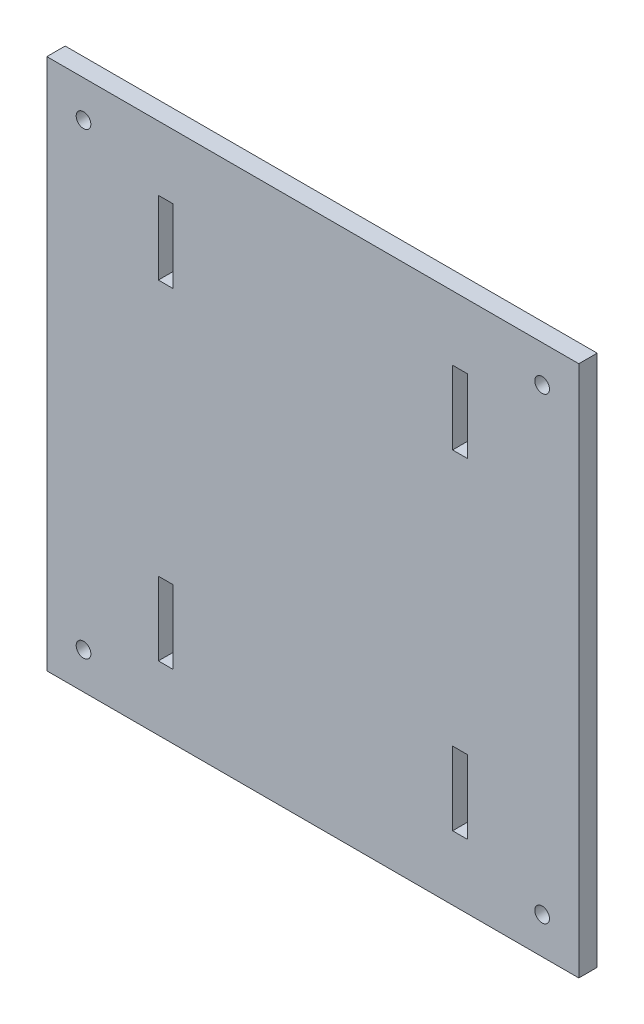
ISO-10303-21;
HEADER;
FILE_DESCRIPTION(('STEP AP214'),'2;1');
FILE_NAME('part.step','',(''),(''),'','','');
FILE_SCHEMA(('AUTOMOTIVE_DESIGN { 1 0 10303 214 1 1 1 1 }'));
ENDSEC;
DATA;
#1=APPLICATION_CONTEXT('core data for automotive mechanical design processes');
#2=APPLICATION_PROTOCOL_DEFINITION('international standard','automotive_design',2000,#1);
#3=PRODUCT_CONTEXT('',#1,'mechanical');
#4=PRODUCT('Part','Part','',(#3));
#5=PRODUCT_RELATED_PRODUCT_CATEGORY('part','',(#4));
#6=PRODUCT_DEFINITION_FORMATION('','',#4);
#7=PRODUCT_DEFINITION_CONTEXT('part definition',#1,'design');
#8=PRODUCT_DEFINITION('design','',#6,#7);
#9=PRODUCT_DEFINITION_SHAPE('','',#8);
#10=(LENGTH_UNIT() NAMED_UNIT(*) SI_UNIT(.MILLI.,.METRE.));
#11=(NAMED_UNIT(*) PLANE_ANGLE_UNIT() SI_UNIT($,.RADIAN.));
#12=(NAMED_UNIT(*) SI_UNIT($,.STERADIAN.) SOLID_ANGLE_UNIT());
#13=UNCERTAINTY_MEASURE_WITH_UNIT(LENGTH_MEASURE(1.E-05),#10,'distance_accuracy_value','');
#14=(GEOMETRIC_REPRESENTATION_CONTEXT(3) GLOBAL_UNCERTAINTY_ASSIGNED_CONTEXT((#13)) GLOBAL_UNIT_ASSIGNED_CONTEXT((#10,
#11,#12)) REPRESENTATION_CONTEXT('',''));
#15=CARTESIAN_POINT('',(0.,0.,0.));
#16=DIRECTION('',(0.,0.,1.));
#17=DIRECTION('',(1.,0.,0.));
#18=AXIS2_PLACEMENT_3D('',#15,#16,#17);
#19=CARTESIAN_POINT('',(-32.9954010493693,86.4917615272113,5.));
#20=DIRECTION('',(1.,0.,0.));
#21=DIRECTION('',(0.,1.,0.));
#22=AXIS2_PLACEMENT_3D('',#19,#20,#21);
#23=PLANE('',#22);
#24=DIRECTION('',(0.,-1.,0.));
#25=VECTOR('',#24,1.);
#26=CARTESIAN_POINT('',(-32.9954010493693,86.4917615272113,0.));
#27=LINE('',#26,#25);
#28=CARTESIAN_POINT('',(-32.9954010493693,86.4917615272113,0.));
#29=VERTEX_POINT('',#28);
#30=CARTESIAN_POINT('',(-32.9954010493693,-58.5082384727887,0.));
#31=VERTEX_POINT('',#30);
#32=EDGE_CURVE('E299',#29,#31,#27,.T.);
#33=ORIENTED_EDGE('',*,*,#32,.T.);
#34=DIRECTION('',(0.,0.,-1.));
#35=VECTOR('',#34,1.);
#36=CARTESIAN_POINT('',(-32.9954010493693,-58.5082384727887,5.));
#37=LINE('',#36,#35);
#38=CARTESIAN_POINT('',(-32.9954010493693,-58.5082384727887,5.));
#39=VERTEX_POINT('',#38);
#40=EDGE_CURVE('E11',#39,#31,#37,.T.);
#41=ORIENTED_EDGE('',*,*,#40,.F.);
#42=DIRECTION('',(0.,-1.,0.));
#43=VECTOR('',#42,1.);
#44=CARTESIAN_POINT('',(-32.9954010493693,86.4917615272113,5.));
#45=LINE('',#44,#43);
#46=CARTESIAN_POINT('',(-32.9954010493693,86.4917615272113,5.));
#47=VERTEX_POINT('',#46);
#48=EDGE_CURVE('E306',#47,#39,#45,.T.);
#49=ORIENTED_EDGE('',*,*,#48,.F.);
#50=DIRECTION('',(0.,0.,-1.));
#51=VECTOR('',#50,1.);
#52=CARTESIAN_POINT('',(-32.9954010493693,86.4917615272113,5.));
#53=LINE('',#52,#51);
#54=EDGE_CURVE('E316',#47,#29,#53,.T.);
#55=ORIENTED_EDGE('',*,*,#54,.T.);
#56=EDGE_LOOP('',(#33,#41,#49,#55));
#57=FACE_BOUND('',#56,.T.);
#58=ADVANCED_FACE('F33',(#57),#23,.F.);
#59=CARTESIAN_POINT('',(-32.9954010493693,-58.5082384727887,5.));
#60=DIRECTION('',(0.,1.,0.));
#61=DIRECTION('',(0.,0.,1.));
#62=AXIS2_PLACEMENT_3D('',#59,#60,#61);
#63=PLANE('',#62);
#64=DIRECTION('',(1.,0.,0.));
#65=VECTOR('',#64,1.);
#66=CARTESIAN_POINT('',(-32.9954010493693,-58.5082384727887,0.));
#67=LINE('',#66,#65);
#68=CARTESIAN_POINT('',(112.004598950631,-58.5082384727887,0.));
#69=VERTEX_POINT('',#68);
#70=EDGE_CURVE('E319',#31,#69,#67,.T.);
#71=ORIENTED_EDGE('',*,*,#70,.T.);
#72=DIRECTION('',(0.,0.,-1.));
#73=VECTOR('',#72,1.);
#74=CARTESIAN_POINT('',(112.004598950631,-58.5082384727887,5.));
#75=LINE('',#74,#73);
#76=CARTESIAN_POINT('',(112.004598950631,-58.5082384727887,5.));
#77=VERTEX_POINT('',#76);
#78=EDGE_CURVE('E40',#77,#69,#75,.T.);
#79=ORIENTED_EDGE('',*,*,#78,.F.);
#80=DIRECTION('',(1.,0.,0.));
#81=VECTOR('',#80,1.);
#82=CARTESIAN_POINT('',(-32.9954010493693,-58.5082384727887,5.));
#83=LINE('',#82,#81);
#84=EDGE_CURVE('E309',#39,#77,#83,.T.);
#85=ORIENTED_EDGE('',*,*,#84,.F.);
#86=ORIENTED_EDGE('',*,*,#40,.T.);
#87=EDGE_LOOP('',(#71,#79,#85,#86));
#88=FACE_BOUND('',#87,.T.);
#89=ADVANCED_FACE('F348',(#88),#63,.F.);
#90=CARTESIAN_POINT('',(112.004598950631,86.4917615272113,5.));
#91=DIRECTION('',(-1.,0.,0.));
#92=DIRECTION('',(0.,-1.,0.));
#93=AXIS2_PLACEMENT_3D('',#90,#91,#92);
#94=PLANE('',#93);
#95=DIRECTION('',(0.,1.,0.));
#96=VECTOR('',#95,1.);
#97=CARTESIAN_POINT('',(112.004598950631,86.4917615272113,0.));
#98=LINE('',#97,#96);
#99=CARTESIAN_POINT('',(112.004598950631,86.4917615272113,0.));
#100=VERTEX_POINT('',#99);
#101=EDGE_CURVE('E321',#69,#100,#98,.T.);
#102=ORIENTED_EDGE('',*,*,#101,.T.);
#103=DIRECTION('',(0.,0.,-1.));
#104=VECTOR('',#103,1.);
#105=CARTESIAN_POINT('',(112.004598950631,86.4917615272113,5.));
#106=LINE('',#105,#104);
#107=CARTESIAN_POINT('',(112.004598950631,86.4917615272113,5.));
#108=VERTEX_POINT('',#107);
#109=EDGE_CURVE('E326',#108,#100,#106,.T.);
#110=ORIENTED_EDGE('',*,*,#109,.F.);
#111=DIRECTION('',(0.,1.,0.));
#112=VECTOR('',#111,1.);
#113=CARTESIAN_POINT('',(112.004598950631,86.4917615272113,5.));
#114=LINE('',#113,#112);
#115=EDGE_CURVE('E312',#77,#108,#114,.T.);
#116=ORIENTED_EDGE('',*,*,#115,.F.);
#117=ORIENTED_EDGE('',*,*,#78,.T.);
#118=EDGE_LOOP('',(#102,#110,#116,#117));
#119=FACE_BOUND('',#118,.T.);
#120=ADVANCED_FACE('F333',(#119),#94,.F.);
#121=CARTESIAN_POINT('',(-32.9954010493693,86.4917615272113,5.));
#122=DIRECTION('',(0.,-1.,0.));
#123=DIRECTION('',(0.,0.,-1.));
#124=AXIS2_PLACEMENT_3D('',#121,#122,#123);
#125=PLANE('',#124);
#126=DIRECTION('',(-1.,0.,0.));
#127=VECTOR('',#126,1.);
#128=CARTESIAN_POINT('',(-32.9954010493693,86.4917615272113,0.));
#129=LINE('',#128,#127);
#130=EDGE_CURVE('E310',#100,#29,#129,.T.);
#131=ORIENTED_EDGE('',*,*,#130,.T.);
#132=ORIENTED_EDGE('',*,*,#54,.F.);
#133=DIRECTION('',(-1.,0.,0.));
#134=VECTOR('',#133,1.);
#135=CARTESIAN_POINT('',(-32.9954010493693,86.4917615272113,5.));
#136=LINE('',#135,#134);
#137=EDGE_CURVE('E314',#108,#47,#136,.T.);
#138=ORIENTED_EDGE('',*,*,#137,.F.);
#139=ORIENTED_EDGE('',*,*,#109,.T.);
#140=EDGE_LOOP('',(#131,#132,#138,#139));
#141=FACE_BOUND('',#140,.T.);
#142=ADVANCED_FACE('F341',(#141),#125,.F.);
#143=CARTESIAN_POINT('',(0.,0.,5.));
#144=DIRECTION('',(0.,0.,1.));
#145=DIRECTION('',(1.,0.,0.));
#146=AXIS2_PLACEMENT_3D('',#143,#144,#145);
#147=PLANE('',#146);
#148=CARTESIAN_POINT('',(-22.9954010493693,-48.5082384727887,5.));
#149=DIRECTION('',(0.,0.,1.));
#150=DIRECTION('',(1.,0.,0.));
#151=AXIS2_PLACEMENT_3D('',#148,#149,#150);
#152=CIRCLE('',#151,2.);
#153=CARTESIAN_POINT('',(-20.9954010493693,-48.5082384727887,5.));
#154=VERTEX_POINT('',#153);
#155=EDGE_CURVE('E446',#154,#154,#152,.T.);
#156=ORIENTED_EDGE('',*,*,#155,.F.);
#157=EDGE_LOOP('',(#156));
#158=FACE_BOUND('',#157,.T.);
#159=CARTESIAN_POINT('',(102.004598950631,-48.5082384727887,5.));
#160=DIRECTION('',(0.,0.,1.));
#161=DIRECTION('',(1.,0.,0.));
#162=AXIS2_PLACEMENT_3D('',#159,#160,#161);
#163=CIRCLE('',#162,2.);
#164=CARTESIAN_POINT('',(104.004598950631,-48.5082384727887,5.));
#165=VERTEX_POINT('',#164);
#166=EDGE_CURVE('E448',#165,#165,#163,.T.);
#167=ORIENTED_EDGE('',*,*,#166,.F.);
#168=EDGE_LOOP('',(#167));
#169=FACE_BOUND('',#168,.T.);
#170=CARTESIAN_POINT('',(102.004598950631,76.4917615272112,5.));
#171=DIRECTION('',(0.,0.,1.));
#172=DIRECTION('',(1.,0.,0.));
#173=AXIS2_PLACEMENT_3D('',#170,#171,#172);
#174=CIRCLE('',#173,2.);
#175=CARTESIAN_POINT('',(104.004598950631,76.4917615272112,5.));
#176=VERTEX_POINT('',#175);
#177=EDGE_CURVE('E454',#176,#176,#174,.T.);
#178=ORIENTED_EDGE('',*,*,#177,.F.);
#179=EDGE_LOOP('',(#178));
#180=FACE_BOUND('',#179,.T.);
#181=CARTESIAN_POINT('',(-22.9954010493693,76.4917615272113,5.));
#182=DIRECTION('',(0.,0.,1.));
#183=DIRECTION('',(1.,0.,0.));
#184=AXIS2_PLACEMENT_3D('',#181,#182,#183);
#185=CIRCLE('',#184,2.);
#186=CARTESIAN_POINT('',(-20.9954010493693,76.4917615272113,5.));
#187=VERTEX_POINT('',#186);
#188=EDGE_CURVE('E193',#187,#187,#185,.T.);
#189=ORIENTED_EDGE('',*,*,#188,.F.);
#190=EDGE_LOOP('',(#189));
#191=FACE_BOUND('',#190,.T.);
#192=DIRECTION('',(0.,-1.,0.));
#193=VECTOR('',#192,1.);
#194=CARTESIAN_POINT('',(77.6045989506307,-20.9582384727888,5.));
#195=LINE('',#194,#193);
#196=CARTESIAN_POINT('',(77.6045989506307,-20.9582384727888,5.));
#197=VERTEX_POINT('',#196);
#198=CARTESIAN_POINT('',(77.6045989506307,-40.9582384727888,5.));
#199=VERTEX_POINT('',#198);
#200=EDGE_CURVE('E47',#197,#199,#195,.T.);
#201=ORIENTED_EDGE('',*,*,#200,.F.);
#202=DIRECTION('',(-1.,0.,0.));
#203=VECTOR('',#202,1.);
#204=CARTESIAN_POINT('',(77.6045989506307,-20.9582384727888,5.));
#205=LINE('',#204,#203);
#206=CARTESIAN_POINT('',(81.6045989506307,-20.9582384727888,5.));
#207=VERTEX_POINT('',#206);
#208=EDGE_CURVE('E187',#207,#197,#205,.T.);
#209=ORIENTED_EDGE('',*,*,#208,.F.);
#210=DIRECTION('',(0.,1.,0.));
#211=VECTOR('',#210,1.);
#212=CARTESIAN_POINT('',(81.6045989506307,-20.9582384727888,5.));
#213=LINE('',#212,#211);
#214=CARTESIAN_POINT('',(81.6045989506307,-40.9582384727888,5.));
#215=VERTEX_POINT('',#214);
#216=EDGE_CURVE('E190',#215,#207,#213,.T.);
#217=ORIENTED_EDGE('',*,*,#216,.F.);
#218=DIRECTION('',(1.,0.,0.));
#219=VECTOR('',#218,1.);
#220=CARTESIAN_POINT('',(77.6045989506307,-40.9582384727888,5.));
#221=LINE('',#220,#219);
#222=EDGE_CURVE('E199',#199,#215,#221,.T.);
#223=ORIENTED_EDGE('',*,*,#222,.F.);
#224=EDGE_LOOP('',(#201,#209,#217,#223));
#225=FACE_BOUND('',#224,.T.);
#226=DIRECTION('',(0.,-1.,0.));
#227=VECTOR('',#226,1.);
#228=CARTESIAN_POINT('',(-2.59540104936933,-20.9582384727888,5.));
#229=LINE('',#228,#227);
#230=CARTESIAN_POINT('',(-2.59540104936933,-20.9582384727888,5.));
#231=VERTEX_POINT('',#230);
#232=CARTESIAN_POINT('',(-2.59540104936933,-40.9582384727888,5.));
#233=VERTEX_POINT('',#232);
#234=EDGE_CURVE('E206',#231,#233,#229,.T.);
#235=ORIENTED_EDGE('',*,*,#234,.F.);
#236=DIRECTION('',(-1.,0.,0.));
#237=VECTOR('',#236,1.);
#238=CARTESIAN_POINT('',(-2.59540104936933,-20.9582384727888,5.));
#239=LINE('',#238,#237);
#240=CARTESIAN_POINT('',(1.40459895063068,-20.9582384727888,5.));
#241=VERTEX_POINT('',#240);
#242=EDGE_CURVE('E214',#241,#231,#239,.T.);
#243=ORIENTED_EDGE('',*,*,#242,.F.);
#244=DIRECTION('',(0.,1.,0.));
#245=VECTOR('',#244,1.);
#246=CARTESIAN_POINT('',(1.40459895063068,-20.9582384727888,5.));
#247=LINE('',#246,#245);
#248=CARTESIAN_POINT('',(1.40459895063068,-40.9582384727888,5.));
#249=VERTEX_POINT('',#248);
#250=EDGE_CURVE('E228',#249,#241,#247,.T.);
#251=ORIENTED_EDGE('',*,*,#250,.F.);
#252=DIRECTION('',(1.,0.,0.));
#253=VECTOR('',#252,1.);
#254=CARTESIAN_POINT('',(-2.59540104936933,-40.9582384727888,5.));
#255=LINE('',#254,#253);
#256=EDGE_CURVE('E225',#233,#249,#255,.T.);
#257=ORIENTED_EDGE('',*,*,#256,.F.);
#258=EDGE_LOOP('',(#235,#243,#251,#257));
#259=FACE_BOUND('',#258,.T.);
#260=DIRECTION('',(0.,-1.,0.));
#261=VECTOR('',#260,1.);
#262=CARTESIAN_POINT('',(77.6045989506307,68.9417615272113,5.));
#263=LINE('',#262,#261);
#264=CARTESIAN_POINT('',(77.6045989506307,68.9417615272113,5.));
#265=VERTEX_POINT('',#264);
#266=CARTESIAN_POINT('',(77.6045989506307,48.9417615272113,5.));
#267=VERTEX_POINT('',#266);
#268=EDGE_CURVE('E235',#265,#267,#263,.T.);
#269=ORIENTED_EDGE('',*,*,#268,.F.);
#270=DIRECTION('',(-1.,0.,0.));
#271=VECTOR('',#270,1.);
#272=CARTESIAN_POINT('',(77.6045989506307,68.9417615272113,5.));
#273=LINE('',#272,#271);
#274=CARTESIAN_POINT('',(81.6045989506307,68.9417615272113,5.));
#275=VERTEX_POINT('',#274);
#276=EDGE_CURVE('E246',#275,#265,#273,.T.);
#277=ORIENTED_EDGE('',*,*,#276,.F.);
#278=DIRECTION('',(0.,1.,0.));
#279=VECTOR('',#278,1.);
#280=CARTESIAN_POINT('',(81.6045989506307,68.9417615272113,5.));
#281=LINE('',#280,#279);
#282=CARTESIAN_POINT('',(81.6045989506307,48.9417615272113,5.));
#283=VERTEX_POINT('',#282);
#284=EDGE_CURVE('E260',#283,#275,#281,.T.);
#285=ORIENTED_EDGE('',*,*,#284,.F.);
#286=DIRECTION('',(1.,0.,0.));
#287=VECTOR('',#286,1.);
#288=CARTESIAN_POINT('',(77.6045989506307,48.9417615272113,5.));
#289=LINE('',#288,#287);
#290=EDGE_CURVE('E257',#267,#283,#289,.T.);
#291=ORIENTED_EDGE('',*,*,#290,.F.);
#292=EDGE_LOOP('',(#269,#277,#285,#291));
#293=FACE_BOUND('',#292,.T.);
#294=DIRECTION('',(0.,-1.,0.));
#295=VECTOR('',#294,1.);
#296=CARTESIAN_POINT('',(-2.59540104936933,68.9417615272113,5.));
#297=LINE('',#296,#295);
#298=CARTESIAN_POINT('',(-2.59540104936933,68.9417615272113,5.));
#299=VERTEX_POINT('',#298);
#300=CARTESIAN_POINT('',(-2.59540104936933,48.9417615272113,5.));
#301=VERTEX_POINT('',#300);
#302=EDGE_CURVE('E267',#299,#301,#297,.T.);
#303=ORIENTED_EDGE('',*,*,#302,.F.);
#304=DIRECTION('',(-1.,0.,0.));
#305=VECTOR('',#304,1.);
#306=CARTESIAN_POINT('',(-2.59540104936933,68.9417615272113,5.));
#307=LINE('',#306,#305);
#308=CARTESIAN_POINT('',(1.40459895063068,68.9417615272113,5.));
#309=VERTEX_POINT('',#308);
#310=EDGE_CURVE('E278',#309,#299,#307,.T.);
#311=ORIENTED_EDGE('',*,*,#310,.F.);
#312=DIRECTION('',(0.,1.,0.));
#313=VECTOR('',#312,1.);
#314=CARTESIAN_POINT('',(1.40459895063068,68.9417615272113,5.));
#315=LINE('',#314,#313);
#316=CARTESIAN_POINT('',(1.40459895063069,48.9417615272113,5.));
#317=VERTEX_POINT('',#316);
#318=EDGE_CURVE('E292',#317,#309,#315,.T.);
#319=ORIENTED_EDGE('',*,*,#318,.F.);
#320=DIRECTION('',(1.,0.,0.));
#321=VECTOR('',#320,1.);
#322=CARTESIAN_POINT('',(-2.59540104936933,48.9417615272113,5.));
#323=LINE('',#322,#321);
#324=EDGE_CURVE('E289',#301,#317,#323,.T.);
#325=ORIENTED_EDGE('',*,*,#324,.F.);
#326=EDGE_LOOP('',(#303,#311,#319,#325));
#327=FACE_BOUND('',#326,.T.);
#328=ORIENTED_EDGE('',*,*,#48,.T.);
#329=ORIENTED_EDGE('',*,*,#84,.T.);
#330=ORIENTED_EDGE('',*,*,#115,.T.);
#331=ORIENTED_EDGE('',*,*,#137,.T.);
#332=EDGE_LOOP('',(#328,#329,#330,#331));
#333=FACE_BOUND('',#332,.T.);
#334=ADVANCED_FACE('F347',(#158,#169,#180,#191,#225,#259,#293,#327,#333),#147,.T.);
#335=CARTESIAN_POINT('',(0.,0.,0.));
#336=DIRECTION('',(0.,0.,1.));
#337=DIRECTION('',(1.,0.,0.));
#338=AXIS2_PLACEMENT_3D('',#335,#336,#337);
#339=PLANE('',#338);
#340=CARTESIAN_POINT('',(-22.9954010493693,-48.5082384727887,0.));
#341=DIRECTION('',(0.,0.,1.));
#342=DIRECTION('',(1.,0.,0.));
#343=AXIS2_PLACEMENT_3D('',#340,#341,#342);
#344=CIRCLE('',#343,2.);
#345=CARTESIAN_POINT('',(-20.9954010493693,-48.5082384727887,0.));
#346=VERTEX_POINT('',#345);
#347=EDGE_CURVE('E443',#346,#346,#344,.T.);
#348=ORIENTED_EDGE('',*,*,#347,.T.);
#349=EDGE_LOOP('',(#348));
#350=FACE_BOUND('',#349,.T.);
#351=CARTESIAN_POINT('',(102.004598950631,-48.5082384727887,0.));
#352=DIRECTION('',(0.,0.,1.));
#353=DIRECTION('',(1.,0.,0.));
#354=AXIS2_PLACEMENT_3D('',#351,#352,#353);
#355=CIRCLE('',#354,2.);
#356=CARTESIAN_POINT('',(104.004598950631,-48.5082384727887,0.));
#357=VERTEX_POINT('',#356);
#358=EDGE_CURVE('E451',#357,#357,#355,.T.);
#359=ORIENTED_EDGE('',*,*,#358,.T.);
#360=EDGE_LOOP('',(#359));
#361=FACE_BOUND('',#360,.T.);
#362=CARTESIAN_POINT('',(102.004598950631,76.4917615272112,0.));
#363=DIRECTION('',(0.,0.,1.));
#364=DIRECTION('',(1.,0.,0.));
#365=AXIS2_PLACEMENT_3D('',#362,#363,#364);
#366=CIRCLE('',#365,2.);
#367=CARTESIAN_POINT('',(104.004598950631,76.4917615272112,0.));
#368=VERTEX_POINT('',#367);
#369=EDGE_CURVE('E457',#368,#368,#366,.T.);
#370=ORIENTED_EDGE('',*,*,#369,.T.);
#371=EDGE_LOOP('',(#370));
#372=FACE_BOUND('',#371,.T.);
#373=CARTESIAN_POINT('',(-22.9954010493693,76.4917615272113,0.));
#374=DIRECTION('',(0.,0.,1.));
#375=DIRECTION('',(1.,0.,0.));
#376=AXIS2_PLACEMENT_3D('',#373,#374,#375);
#377=CIRCLE('',#376,2.);
#378=CARTESIAN_POINT('',(-20.9954010493693,76.4917615272113,0.));
#379=VERTEX_POINT('',#378);
#380=EDGE_CURVE('E200',#379,#379,#377,.T.);
#381=ORIENTED_EDGE('',*,*,#380,.T.);
#382=EDGE_LOOP('',(#381));
#383=FACE_BOUND('',#382,.T.);
#384=DIRECTION('',(-1.,0.,0.));
#385=VECTOR('',#384,1.);
#386=CARTESIAN_POINT('',(77.6045989506307,-20.9582384727888,0.));
#387=LINE('',#386,#385);
#388=CARTESIAN_POINT('',(81.6045989506307,-20.9582384727888,0.));
#389=VERTEX_POINT('',#388);
#390=CARTESIAN_POINT('',(77.6045989506307,-20.9582384727888,0.));
#391=VERTEX_POINT('',#390);
#392=EDGE_CURVE('E177',#389,#391,#387,.T.);
#393=ORIENTED_EDGE('',*,*,#392,.T.);
#394=DIRECTION('',(0.,-1.,0.));
#395=VECTOR('',#394,1.);
#396=CARTESIAN_POINT('',(77.6045989506307,-20.9582384727888,0.));
#397=LINE('',#396,#395);
#398=CARTESIAN_POINT('',(77.6045989506307,-40.9582384727888,0.));
#399=VERTEX_POINT('',#398);
#400=EDGE_CURVE('E171',#391,#399,#397,.T.);
#401=ORIENTED_EDGE('',*,*,#400,.T.);
#402=DIRECTION('',(1.,0.,0.));
#403=VECTOR('',#402,1.);
#404=CARTESIAN_POINT('',(77.6045989506307,-40.9582384727888,0.));
#405=LINE('',#404,#403);
#406=CARTESIAN_POINT('',(81.6045989506307,-40.9582384727888,0.));
#407=VERTEX_POINT('',#406);
#408=EDGE_CURVE('E180',#399,#407,#405,.T.);
#409=ORIENTED_EDGE('',*,*,#408,.T.);
#410=DIRECTION('',(0.,1.,0.));
#411=VECTOR('',#410,1.);
#412=CARTESIAN_POINT('',(81.6045989506307,-20.9582384727888,0.));
#413=LINE('',#412,#411);
#414=EDGE_CURVE('E55',#407,#389,#413,.T.);
#415=ORIENTED_EDGE('',*,*,#414,.T.);
#416=EDGE_LOOP('',(#393,#401,#409,#415));
#417=FACE_BOUND('',#416,.T.);
#418=DIRECTION('',(-1.,0.,0.));
#419=VECTOR('',#418,1.);
#420=CARTESIAN_POINT('',(-2.59540104936933,-20.9582384727888,0.));
#421=LINE('',#420,#419);
#422=CARTESIAN_POINT('',(1.40459895063068,-20.9582384727888,0.));
#423=VERTEX_POINT('',#422);
#424=CARTESIAN_POINT('',(-2.59540104936933,-20.9582384727888,0.));
#425=VERTEX_POINT('',#424);
#426=EDGE_CURVE('E220',#423,#425,#421,.T.);
#427=ORIENTED_EDGE('',*,*,#426,.T.);
#428=DIRECTION('',(0.,-1.,0.));
#429=VECTOR('',#428,1.);
#430=CARTESIAN_POINT('',(-2.59540104936933,-20.9582384727888,0.));
#431=LINE('',#430,#429);
#432=CARTESIAN_POINT('',(-2.59540104936933,-40.9582384727888,0.));
#433=VERTEX_POINT('',#432);
#434=EDGE_CURVE('E210',#425,#433,#431,.T.);
#435=ORIENTED_EDGE('',*,*,#434,.T.);
#436=DIRECTION('',(1.,0.,0.));
#437=VECTOR('',#436,1.);
#438=CARTESIAN_POINT('',(-2.59540104936933,-40.9582384727888,0.));
#439=LINE('',#438,#437);
#440=CARTESIAN_POINT('',(1.40459895063068,-40.9582384727888,0.));
#441=VERTEX_POINT('',#440);
#442=EDGE_CURVE('E213',#433,#441,#439,.T.);
#443=ORIENTED_EDGE('',*,*,#442,.T.);
#444=DIRECTION('',(0.,1.,0.));
#445=VECTOR('',#444,1.);
#446=CARTESIAN_POINT('',(1.40459895063068,-20.9582384727888,0.));
#447=LINE('',#446,#445);
#448=EDGE_CURVE('E217',#441,#423,#447,.T.);
#449=ORIENTED_EDGE('',*,*,#448,.T.);
#450=EDGE_LOOP('',(#427,#435,#443,#449));
#451=FACE_BOUND('',#450,.T.);
#452=DIRECTION('',(-1.,0.,0.));
#453=VECTOR('',#452,1.);
#454=CARTESIAN_POINT('',(77.6045989506307,68.9417615272113,0.));
#455=LINE('',#454,#453);
#456=CARTESIAN_POINT('',(81.6045989506307,68.9417615272113,0.));
#457=VERTEX_POINT('',#456);
#458=CARTESIAN_POINT('',(77.6045989506307,68.9417615272113,0.));
#459=VERTEX_POINT('',#458);
#460=EDGE_CURVE('E252',#457,#459,#455,.T.);
#461=ORIENTED_EDGE('',*,*,#460,.T.);
#462=DIRECTION('',(0.,-1.,0.));
#463=VECTOR('',#462,1.);
#464=CARTESIAN_POINT('',(77.6045989506307,68.9417615272113,0.));
#465=LINE('',#464,#463);
#466=CARTESIAN_POINT('',(77.6045989506307,48.9417615272113,0.));
#467=VERTEX_POINT('',#466);
#468=EDGE_CURVE('E242',#459,#467,#465,.T.);
#469=ORIENTED_EDGE('',*,*,#468,.T.);
#470=DIRECTION('',(1.,0.,0.));
#471=VECTOR('',#470,1.);
#472=CARTESIAN_POINT('',(77.6045989506307,48.9417615272113,0.));
#473=LINE('',#472,#471);
#474=CARTESIAN_POINT('',(81.6045989506307,48.9417615272113,0.));
#475=VERTEX_POINT('',#474);
#476=EDGE_CURVE('E245',#467,#475,#473,.T.);
#477=ORIENTED_EDGE('',*,*,#476,.T.);
#478=DIRECTION('',(0.,1.,0.));
#479=VECTOR('',#478,1.);
#480=CARTESIAN_POINT('',(81.6045989506307,68.9417615272113,0.));
#481=LINE('',#480,#479);
#482=EDGE_CURVE('E249',#475,#457,#481,.T.);
#483=ORIENTED_EDGE('',*,*,#482,.T.);
#484=EDGE_LOOP('',(#461,#469,#477,#483));
#485=FACE_BOUND('',#484,.T.);
#486=DIRECTION('',(-1.,0.,0.));
#487=VECTOR('',#486,1.);
#488=CARTESIAN_POINT('',(-2.59540104936933,68.9417615272113,0.));
#489=LINE('',#488,#487);
#490=CARTESIAN_POINT('',(1.40459895063068,68.9417615272113,0.));
#491=VERTEX_POINT('',#490);
#492=CARTESIAN_POINT('',(-2.59540104936933,68.9417615272113,0.));
#493=VERTEX_POINT('',#492);
#494=EDGE_CURVE('E284',#491,#493,#489,.T.);
#495=ORIENTED_EDGE('',*,*,#494,.T.);
#496=DIRECTION('',(0.,-1.,0.));
#497=VECTOR('',#496,1.);
#498=CARTESIAN_POINT('',(-2.59540104936933,68.9417615272113,0.));
#499=LINE('',#498,#497);
#500=CARTESIAN_POINT('',(-2.59540104936933,48.9417615272113,0.));
#501=VERTEX_POINT('',#500);
#502=EDGE_CURVE('E274',#493,#501,#499,.T.);
#503=ORIENTED_EDGE('',*,*,#502,.T.);
#504=DIRECTION('',(1.,0.,0.));
#505=VECTOR('',#504,1.);
#506=CARTESIAN_POINT('',(-2.59540104936933,48.9417615272113,0.));
#507=LINE('',#506,#505);
#508=CARTESIAN_POINT('',(1.40459895063069,48.9417615272113,0.));
#509=VERTEX_POINT('',#508);
#510=EDGE_CURVE('E277',#501,#509,#507,.T.);
#511=ORIENTED_EDGE('',*,*,#510,.T.);
#512=DIRECTION('',(0.,1.,0.));
#513=VECTOR('',#512,1.);
#514=CARTESIAN_POINT('',(1.40459895063068,68.9417615272113,0.));
#515=LINE('',#514,#513);
#516=EDGE_CURVE('E281',#509,#491,#515,.T.);
#517=ORIENTED_EDGE('',*,*,#516,.T.);
#518=EDGE_LOOP('',(#495,#503,#511,#517));
#519=FACE_BOUND('',#518,.T.);
#520=ORIENTED_EDGE('',*,*,#32,.F.);
#521=ORIENTED_EDGE('',*,*,#130,.F.);
#522=ORIENTED_EDGE('',*,*,#101,.F.);
#523=ORIENTED_EDGE('',*,*,#70,.F.);
#524=EDGE_LOOP('',(#520,#521,#522,#523));
#525=FACE_BOUND('',#524,.T.);
#526=ADVANCED_FACE('F184',(#350,#361,#372,#383,#417,#451,#485,#519,#525),#339,.F.);
#527=CARTESIAN_POINT('',(-2.59540104936933,68.9417615272113,0.));
#528=DIRECTION('',(-1.,0.,0.));
#529=DIRECTION('',(0.,0.,1.));
#530=AXIS2_PLACEMENT_3D('',#527,#528,#529);
#531=PLANE('',#530);
#532=ORIENTED_EDGE('',*,*,#302,.T.);
#533=DIRECTION('',(0.,0.,1.));
#534=VECTOR('',#533,1.);
#535=CARTESIAN_POINT('',(-2.59540104936933,48.9417615272113,0.));
#536=LINE('',#535,#534);
#537=EDGE_CURVE('E287',#501,#301,#536,.T.);
#538=ORIENTED_EDGE('',*,*,#537,.F.);
#539=ORIENTED_EDGE('',*,*,#502,.F.);
#540=DIRECTION('',(0.,0.,1.));
#541=VECTOR('',#540,1.);
#542=CARTESIAN_POINT('',(-2.59540104936933,68.9417615272113,0.));
#543=LINE('',#542,#541);
#544=EDGE_CURVE('E297',#493,#299,#543,.T.);
#545=ORIENTED_EDGE('',*,*,#544,.T.);
#546=EDGE_LOOP('',(#532,#538,#539,#545));
#547=FACE_BOUND('',#546,.T.);
#548=ADVANCED_FACE('F360',(#547),#531,.F.);
#549=CARTESIAN_POINT('',(-2.59540104936933,68.9417615272113,0.));
#550=DIRECTION('',(0.,1.,0.));
#551=DIRECTION('',(0.,0.,1.));
#552=AXIS2_PLACEMENT_3D('',#549,#550,#551);
#553=PLANE('',#552);
#554=ORIENTED_EDGE('',*,*,#310,.T.);
#555=ORIENTED_EDGE('',*,*,#544,.F.);
#556=ORIENTED_EDGE('',*,*,#494,.F.);
#557=DIRECTION('',(0.,0.,1.));
#558=VECTOR('',#557,1.);
#559=CARTESIAN_POINT('',(1.40459895063068,68.9417615272113,0.));
#560=LINE('',#559,#558);
#561=EDGE_CURVE('E300',#491,#309,#560,.T.);
#562=ORIENTED_EDGE('',*,*,#561,.T.);
#563=EDGE_LOOP('',(#554,#555,#556,#562));
#564=FACE_BOUND('',#563,.T.);
#565=ADVANCED_FACE('F367',(#564),#553,.F.);
#566=CARTESIAN_POINT('',(1.40459895063068,68.9417615272113,0.));
#567=DIRECTION('',(1.,0.,0.));
#568=DIRECTION('',(0.,1.,0.));
#569=AXIS2_PLACEMENT_3D('',#566,#567,#568);
#570=PLANE('',#569);
#571=ORIENTED_EDGE('',*,*,#318,.T.);
#572=ORIENTED_EDGE('',*,*,#561,.F.);
#573=ORIENTED_EDGE('',*,*,#516,.F.);
#574=DIRECTION('',(0.,0.,1.));
#575=VECTOR('',#574,1.);
#576=CARTESIAN_POINT('',(1.40459895063069,48.9417615272113,0.));
#577=LINE('',#576,#575);
#578=EDGE_CURVE('E302',#509,#317,#577,.T.);
#579=ORIENTED_EDGE('',*,*,#578,.T.);
#580=EDGE_LOOP('',(#571,#572,#573,#579));
#581=FACE_BOUND('',#580,.T.);
#582=ADVANCED_FACE('F373',(#581),#570,.F.);
#583=CARTESIAN_POINT('',(-2.59540104936933,48.9417615272113,0.));
#584=DIRECTION('',(0.,-1.,0.));
#585=DIRECTION('',(0.,0.,-1.));
#586=AXIS2_PLACEMENT_3D('',#583,#584,#585);
#587=PLANE('',#586);
#588=ORIENTED_EDGE('',*,*,#324,.T.);
#589=ORIENTED_EDGE('',*,*,#578,.F.);
#590=ORIENTED_EDGE('',*,*,#510,.F.);
#591=ORIENTED_EDGE('',*,*,#537,.T.);
#592=EDGE_LOOP('',(#588,#589,#590,#591));
#593=FACE_BOUND('',#592,.T.);
#594=ADVANCED_FACE('F369',(#593),#587,.F.);
#595=CARTESIAN_POINT('',(77.6045989506307,68.9417615272113,0.));
#596=DIRECTION('',(-1.,0.,0.));
#597=DIRECTION('',(0.,0.,1.));
#598=AXIS2_PLACEMENT_3D('',#595,#596,#597);
#599=PLANE('',#598);
#600=ORIENTED_EDGE('',*,*,#268,.T.);
#601=DIRECTION('',(0.,0.,1.));
#602=VECTOR('',#601,1.);
#603=CARTESIAN_POINT('',(77.6045989506307,48.9417615272113,0.));
#604=LINE('',#603,#602);
#605=EDGE_CURVE('E255',#467,#267,#604,.T.);
#606=ORIENTED_EDGE('',*,*,#605,.F.);
#607=ORIENTED_EDGE('',*,*,#468,.F.);
#608=DIRECTION('',(0.,0.,1.));
#609=VECTOR('',#608,1.);
#610=CARTESIAN_POINT('',(77.6045989506307,68.9417615272113,0.));
#611=LINE('',#610,#609);
#612=EDGE_CURVE('E265',#459,#265,#611,.T.);
#613=ORIENTED_EDGE('',*,*,#612,.T.);
#614=EDGE_LOOP('',(#600,#606,#607,#613));
#615=FACE_BOUND('',#614,.T.);
#616=ADVANCED_FACE('F372',(#615),#599,.F.);
#617=CARTESIAN_POINT('',(77.6045989506307,68.9417615272113,0.));
#618=DIRECTION('',(0.,1.,0.));
#619=DIRECTION('',(0.,0.,1.));
#620=AXIS2_PLACEMENT_3D('',#617,#618,#619);
#621=PLANE('',#620);
#622=ORIENTED_EDGE('',*,*,#276,.T.);
#623=ORIENTED_EDGE('',*,*,#612,.F.);
#624=ORIENTED_EDGE('',*,*,#460,.F.);
#625=DIRECTION('',(0.,0.,1.));
#626=VECTOR('',#625,1.);
#627=CARTESIAN_POINT('',(81.6045989506307,68.9417615272113,0.));
#628=LINE('',#627,#626);
#629=EDGE_CURVE('E268',#457,#275,#628,.T.);
#630=ORIENTED_EDGE('',*,*,#629,.T.);
#631=EDGE_LOOP('',(#622,#623,#624,#630));
#632=FACE_BOUND('',#631,.T.);
#633=ADVANCED_FACE('F383',(#632),#621,.F.);
#634=CARTESIAN_POINT('',(81.6045989506307,68.9417615272113,0.));
#635=DIRECTION('',(1.,0.,0.));
#636=DIRECTION('',(0.,0.,-1.));
#637=AXIS2_PLACEMENT_3D('',#634,#635,#636);
#638=PLANE('',#637);
#639=ORIENTED_EDGE('',*,*,#284,.T.);
#640=ORIENTED_EDGE('',*,*,#629,.F.);
#641=ORIENTED_EDGE('',*,*,#482,.F.);
#642=DIRECTION('',(0.,0.,1.));
#643=VECTOR('',#642,1.);
#644=CARTESIAN_POINT('',(81.6045989506307,48.9417615272113,0.));
#645=LINE('',#644,#643);
#646=EDGE_CURVE('E270',#475,#283,#645,.T.);
#647=ORIENTED_EDGE('',*,*,#646,.T.);
#648=EDGE_LOOP('',(#639,#640,#641,#647));
#649=FACE_BOUND('',#648,.T.);
#650=ADVANCED_FACE('F389',(#649),#638,.F.);
#651=CARTESIAN_POINT('',(77.6045989506307,48.9417615272113,0.));
#652=DIRECTION('',(0.,-1.,0.));
#653=DIRECTION('',(0.,0.,-1.));
#654=AXIS2_PLACEMENT_3D('',#651,#652,#653);
#655=PLANE('',#654);
#656=ORIENTED_EDGE('',*,*,#290,.T.);
#657=ORIENTED_EDGE('',*,*,#646,.F.);
#658=ORIENTED_EDGE('',*,*,#476,.F.);
#659=ORIENTED_EDGE('',*,*,#605,.T.);
#660=EDGE_LOOP('',(#656,#657,#658,#659));
#661=FACE_BOUND('',#660,.T.);
#662=ADVANCED_FACE('F385',(#661),#655,.F.);
#663=CARTESIAN_POINT('',(-2.59540104936933,-20.9582384727888,0.));
#664=DIRECTION('',(-1.,0.,0.));
#665=DIRECTION('',(0.,0.,1.));
#666=AXIS2_PLACEMENT_3D('',#663,#664,#665);
#667=PLANE('',#666);
#668=ORIENTED_EDGE('',*,*,#234,.T.);
#669=DIRECTION('',(0.,0.,1.));
#670=VECTOR('',#669,1.);
#671=CARTESIAN_POINT('',(-2.59540104936933,-40.9582384727888,0.));
#672=LINE('',#671,#670);
#673=EDGE_CURVE('E223',#433,#233,#672,.T.);
#674=ORIENTED_EDGE('',*,*,#673,.F.);
#675=ORIENTED_EDGE('',*,*,#434,.F.);
#676=DIRECTION('',(0.,0.,1.));
#677=VECTOR('',#676,1.);
#678=CARTESIAN_POINT('',(-2.59540104936933,-20.9582384727888,0.));
#679=LINE('',#678,#677);
#680=EDGE_CURVE('E233',#425,#231,#679,.T.);
#681=ORIENTED_EDGE('',*,*,#680,.T.);
#682=EDGE_LOOP('',(#668,#674,#675,#681));
#683=FACE_BOUND('',#682,.T.);
#684=ADVANCED_FACE('F388',(#683),#667,.F.);
#685=CARTESIAN_POINT('',(-2.59540104936933,-20.9582384727888,0.));
#686=DIRECTION('',(0.,1.,0.));
#687=DIRECTION('',(0.,0.,1.));
#688=AXIS2_PLACEMENT_3D('',#685,#686,#687);
#689=PLANE('',#688);
#690=ORIENTED_EDGE('',*,*,#242,.T.);
#691=ORIENTED_EDGE('',*,*,#680,.F.);
#692=ORIENTED_EDGE('',*,*,#426,.F.);
#693=DIRECTION('',(0.,0.,1.));
#694=VECTOR('',#693,1.);
#695=CARTESIAN_POINT('',(1.40459895063068,-20.9582384727888,0.));
#696=LINE('',#695,#694);
#697=EDGE_CURVE('E236',#423,#241,#696,.T.);
#698=ORIENTED_EDGE('',*,*,#697,.T.);
#699=EDGE_LOOP('',(#690,#691,#692,#698));
#700=FACE_BOUND('',#699,.T.);
#701=ADVANCED_FACE('F399',(#700),#689,.F.);
#702=CARTESIAN_POINT('',(1.40459895063068,-20.9582384727888,0.));
#703=DIRECTION('',(1.,0.,0.));
#704=DIRECTION('',(0.,0.,-1.));
#705=AXIS2_PLACEMENT_3D('',#702,#703,#704);
#706=PLANE('',#705);
#707=ORIENTED_EDGE('',*,*,#250,.T.);
#708=ORIENTED_EDGE('',*,*,#697,.F.);
#709=ORIENTED_EDGE('',*,*,#448,.F.);
#710=DIRECTION('',(0.,0.,1.));
#711=VECTOR('',#710,1.);
#712=CARTESIAN_POINT('',(1.40459895063068,-40.9582384727888,0.));
#713=LINE('',#712,#711);
#714=EDGE_CURVE('E238',#441,#249,#713,.T.);
#715=ORIENTED_EDGE('',*,*,#714,.T.);
#716=EDGE_LOOP('',(#707,#708,#709,#715));
#717=FACE_BOUND('',#716,.T.);
#718=ADVANCED_FACE('F404',(#717),#706,.F.);
#719=CARTESIAN_POINT('',(-2.59540104936933,-40.9582384727888,0.));
#720=DIRECTION('',(0.,-1.,0.));
#721=DIRECTION('',(0.,0.,-1.));
#722=AXIS2_PLACEMENT_3D('',#719,#720,#721);
#723=PLANE('',#722);
#724=ORIENTED_EDGE('',*,*,#256,.T.);
#725=ORIENTED_EDGE('',*,*,#714,.F.);
#726=ORIENTED_EDGE('',*,*,#442,.F.);
#727=ORIENTED_EDGE('',*,*,#673,.T.);
#728=EDGE_LOOP('',(#724,#725,#726,#727));
#729=FACE_BOUND('',#728,.T.);
#730=ADVANCED_FACE('F401',(#729),#723,.F.);
#731=CARTESIAN_POINT('',(77.6045989506307,-20.9582384727888,0.));
#732=DIRECTION('',(-1.,0.,0.));
#733=DIRECTION('',(0.,0.,1.));
#734=AXIS2_PLACEMENT_3D('',#731,#732,#733);
#735=PLANE('',#734);
#736=ORIENTED_EDGE('',*,*,#200,.T.);
#737=DIRECTION('',(0.,0.,1.));
#738=VECTOR('',#737,1.);
#739=CARTESIAN_POINT('',(77.6045989506307,-40.9582384727888,0.));
#740=LINE('',#739,#738);
#741=EDGE_CURVE('E167',#399,#199,#740,.T.);
#742=ORIENTED_EDGE('',*,*,#741,.F.);
#743=ORIENTED_EDGE('',*,*,#400,.F.);
#744=DIRECTION('',(0.,0.,1.));
#745=VECTOR('',#744,1.);
#746=CARTESIAN_POINT('',(77.6045989506307,-20.9582384727888,0.));
#747=LINE('',#746,#745);
#748=EDGE_CURVE('E204',#391,#197,#747,.T.);
#749=ORIENTED_EDGE('',*,*,#748,.T.);
#750=EDGE_LOOP('',(#736,#742,#743,#749));
#751=FACE_BOUND('',#750,.T.);
#752=ADVANCED_FACE('F169',(#751),#735,.F.);
#753=CARTESIAN_POINT('',(77.6045989506307,-20.9582384727888,0.));
#754=DIRECTION('',(0.,1.,0.));
#755=DIRECTION('',(0.,0.,1.));
#756=AXIS2_PLACEMENT_3D('',#753,#754,#755);
#757=PLANE('',#756);
#758=ORIENTED_EDGE('',*,*,#208,.T.);
#759=ORIENTED_EDGE('',*,*,#748,.F.);
#760=ORIENTED_EDGE('',*,*,#392,.F.);
#761=DIRECTION('',(0.,0.,1.));
#762=VECTOR('',#761,1.);
#763=CARTESIAN_POINT('',(81.6045989506307,-20.9582384727888,0.));
#764=LINE('',#763,#762);
#765=EDGE_CURVE('E207',#389,#207,#764,.T.);
#766=ORIENTED_EDGE('',*,*,#765,.T.);
#767=EDGE_LOOP('',(#758,#759,#760,#766));
#768=FACE_BOUND('',#767,.T.);
#769=ADVANCED_FACE('F414',(#768),#757,.F.);
#770=CARTESIAN_POINT('',(81.6045989506307,-20.9582384727888,0.));
#771=DIRECTION('',(1.,0.,0.));
#772=DIRECTION('',(0.,0.,-1.));
#773=AXIS2_PLACEMENT_3D('',#770,#771,#772);
#774=PLANE('',#773);
#775=ORIENTED_EDGE('',*,*,#216,.T.);
#776=ORIENTED_EDGE('',*,*,#765,.F.);
#777=ORIENTED_EDGE('',*,*,#414,.F.);
#778=DIRECTION('',(0.,0.,1.));
#779=VECTOR('',#778,1.);
#780=CARTESIAN_POINT('',(81.6045989506307,-40.9582384727888,0.));
#781=LINE('',#780,#779);
#782=EDGE_CURVE('E176',#407,#215,#781,.T.);
#783=ORIENTED_EDGE('',*,*,#782,.T.);
#784=EDGE_LOOP('',(#775,#776,#777,#783));
#785=FACE_BOUND('',#784,.T.);
#786=ADVANCED_FACE('F418',(#785),#774,.F.);
#787=CARTESIAN_POINT('',(77.6045989506307,-40.9582384727888,0.));
#788=DIRECTION('',(0.,-1.,0.));
#789=DIRECTION('',(0.,0.,-1.));
#790=AXIS2_PLACEMENT_3D('',#787,#788,#789);
#791=PLANE('',#790);
#792=ORIENTED_EDGE('',*,*,#222,.T.);
#793=ORIENTED_EDGE('',*,*,#782,.F.);
#794=ORIENTED_EDGE('',*,*,#408,.F.);
#795=ORIENTED_EDGE('',*,*,#741,.T.);
#796=EDGE_LOOP('',(#792,#793,#794,#795));
#797=FACE_BOUND('',#796,.T.);
#798=ADVANCED_FACE('F181',(#797),#791,.F.);
#799=CARTESIAN_POINT('',(-22.9954010493693,76.4917615272113,0.));
#800=DIRECTION('',(0.,0.,1.));
#801=DIRECTION('',(1.,0.,0.));
#802=AXIS2_PLACEMENT_3D('',#799,#800,#801);
#803=CYLINDRICAL_SURFACE('',#802,2.);
#804=ORIENTED_EDGE('',*,*,#380,.F.);
#805=EDGE_LOOP('',(#804));
#806=FACE_BOUND('',#805,.T.);
#807=ORIENTED_EDGE('',*,*,#188,.T.);
#808=EDGE_LOOP('',(#807));
#809=FACE_BOUND('',#808,.T.);
#810=ADVANCED_FACE('F417',(#806,#809),#803,.F.);
#811=CARTESIAN_POINT('',(102.004598950631,76.4917615272112,0.));
#812=DIRECTION('',(0.,0.,1.));
#813=DIRECTION('',(1.,0.,0.));
#814=AXIS2_PLACEMENT_3D('',#811,#812,#813);
#815=CYLINDRICAL_SURFACE('',#814,2.);
#816=ORIENTED_EDGE('',*,*,#369,.F.);
#817=EDGE_LOOP('',(#816));
#818=FACE_BOUND('',#817,.T.);
#819=ORIENTED_EDGE('',*,*,#177,.T.);
#820=EDGE_LOOP('',(#819));
#821=FACE_BOUND('',#820,.T.);
#822=ADVANCED_FACE('F426',(#818,#821),#815,.F.);
#823=CARTESIAN_POINT('',(102.004598950631,-48.5082384727887,0.));
#824=DIRECTION('',(0.,0.,1.));
#825=DIRECTION('',(1.,0.,0.));
#826=AXIS2_PLACEMENT_3D('',#823,#824,#825);
#827=CYLINDRICAL_SURFACE('',#826,2.);
#828=ORIENTED_EDGE('',*,*,#358,.F.);
#829=EDGE_LOOP('',(#828));
#830=FACE_BOUND('',#829,.T.);
#831=ORIENTED_EDGE('',*,*,#166,.T.);
#832=EDGE_LOOP('',(#831));
#833=FACE_BOUND('',#832,.T.);
#834=ADVANCED_FACE('F430',(#830,#833),#827,.F.);
#835=CARTESIAN_POINT('',(-22.9954010493693,-48.5082384727887,0.));
#836=DIRECTION('',(0.,0.,1.));
#837=DIRECTION('',(1.,0.,0.));
#838=AXIS2_PLACEMENT_3D('',#835,#836,#837);
#839=CYLINDRICAL_SURFACE('',#838,2.);
#840=ORIENTED_EDGE('',*,*,#347,.F.);
#841=EDGE_LOOP('',(#840));
#842=FACE_BOUND('',#841,.T.);
#843=ORIENTED_EDGE('',*,*,#155,.T.);
#844=EDGE_LOOP('',(#843));
#845=FACE_BOUND('',#844,.T.);
#846=ADVANCED_FACE('F434',(#842,#845),#839,.F.);
#847=CLOSED_SHELL('',(#58,#89,#120,#142,#334,#526,#548,#565,#582,#594,#616,#633,#650,#662,#684,
#701,#718,#730,#752,#769,#786,#798,#810,#822,#834,#846));
#848=MANIFOLD_SOLID_BREP('B2',#847);
#849=ADVANCED_BREP_SHAPE_REPRESENTATION('',(#18,#848),#14);
#850=SHAPE_DEFINITION_REPRESENTATION(#9,#849);
ENDSEC;
END-ISO-10303-21;
